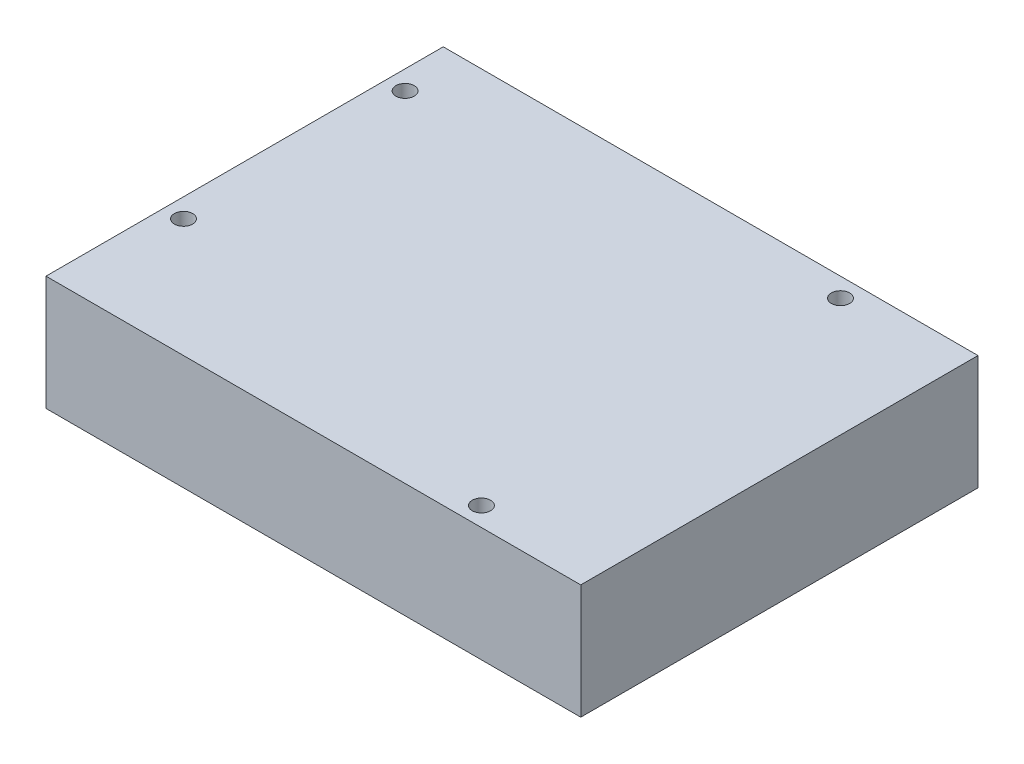
ISO-10303-21;
HEADER;
FILE_DESCRIPTION(('STEP AP214'),'2;1');
FILE_NAME('part.step','',(''),(''),'','','');
FILE_SCHEMA(('AUTOMOTIVE_DESIGN { 1 0 10303 214 1 1 1 1 }'));
ENDSEC;
DATA;
#1=APPLICATION_CONTEXT('core data for automotive mechanical design processes');
#2=APPLICATION_PROTOCOL_DEFINITION('international standard','automotive_design',2000,#1);
#3=PRODUCT_CONTEXT('',#1,'mechanical');
#4=PRODUCT('Part','Part','',(#3));
#5=PRODUCT_RELATED_PRODUCT_CATEGORY('part','',(#4));
#6=PRODUCT_DEFINITION_FORMATION('','',#4);
#7=PRODUCT_DEFINITION_CONTEXT('part definition',#1,'design');
#8=PRODUCT_DEFINITION('design','',#6,#7);
#9=PRODUCT_DEFINITION_SHAPE('','',#8);
#10=(LENGTH_UNIT() NAMED_UNIT(*) SI_UNIT(.MILLI.,.METRE.));
#11=(NAMED_UNIT(*) PLANE_ANGLE_UNIT() SI_UNIT($,.RADIAN.));
#12=(NAMED_UNIT(*) SI_UNIT($,.STERADIAN.) SOLID_ANGLE_UNIT());
#13=UNCERTAINTY_MEASURE_WITH_UNIT(LENGTH_MEASURE(1.E-05),#10,'distance_accuracy_value','');
#14=(GEOMETRIC_REPRESENTATION_CONTEXT(3) GLOBAL_UNCERTAINTY_ASSIGNED_CONTEXT((#13)) GLOBAL_UNIT_ASSIGNED_CONTEXT((#10,
#11,#12)) REPRESENTATION_CONTEXT('',''));
#15=CARTESIAN_POINT('',(0.,0.,0.));
#16=DIRECTION('',(0.,0.,1.));
#17=DIRECTION('',(1.,0.,0.));
#18=AXIS2_PLACEMENT_3D('',#15,#16,#17);
#19=CARTESIAN_POINT('',(35.,15.,-26.));
#20=DIRECTION('',(-1.,0.,0.));
#21=DIRECTION('',(0.,0.,1.));
#22=AXIS2_PLACEMENT_3D('',#19,#20,#21);
#23=PLANE('',#22);
#24=DIRECTION('',(0.,0.,-1.));
#25=VECTOR('',#24,1.);
#26=CARTESIAN_POINT('',(35.,0.,-26.));
#27=LINE('',#26,#25);
#28=CARTESIAN_POINT('',(35.,0.,26.));
#29=VERTEX_POINT('',#28);
#30=CARTESIAN_POINT('',(35.,0.,-26.));
#31=VERTEX_POINT('',#30);
#32=EDGE_CURVE('E107',#29,#31,#27,.T.);
#33=ORIENTED_EDGE('',*,*,#32,.T.);
#34=DIRECTION('',(0.,-1.,0.));
#35=VECTOR('',#34,1.);
#36=CARTESIAN_POINT('',(35.,15.,-26.));
#37=LINE('',#36,#35);
#38=CARTESIAN_POINT('',(35.,15.,-26.));
#39=VERTEX_POINT('',#38);
#40=EDGE_CURVE('E11',#39,#31,#37,.T.);
#41=ORIENTED_EDGE('',*,*,#40,.F.);
#42=DIRECTION('',(0.,0.,-1.));
#43=VECTOR('',#42,1.);
#44=CARTESIAN_POINT('',(35.,15.,-26.));
#45=LINE('',#44,#43);
#46=CARTESIAN_POINT('',(35.,15.,26.));
#47=VERTEX_POINT('',#46);
#48=EDGE_CURVE('E91',#47,#39,#45,.T.);
#49=ORIENTED_EDGE('',*,*,#48,.F.);
#50=DIRECTION('',(0.,-1.,0.));
#51=VECTOR('',#50,1.);
#52=CARTESIAN_POINT('',(35.,15.,26.));
#53=LINE('',#52,#51);
#54=EDGE_CURVE('E103',#47,#29,#53,.T.);
#55=ORIENTED_EDGE('',*,*,#54,.T.);
#56=EDGE_LOOP('',(#33,#41,#49,#55));
#57=FACE_BOUND('',#56,.T.);
#58=ADVANCED_FACE('F39',(#57),#23,.F.);
#59=CARTESIAN_POINT('',(-35.,15.,-26.));
#60=DIRECTION('',(0.,0.,1.));
#61=DIRECTION('',(1.,0.,0.));
#62=AXIS2_PLACEMENT_3D('',#59,#60,#61);
#63=PLANE('',#62);
#64=DIRECTION('',(-1.,0.,0.));
#65=VECTOR('',#64,1.);
#66=CARTESIAN_POINT('',(-35.,0.,-26.));
#67=LINE('',#66,#65);
#68=CARTESIAN_POINT('',(-35.,0.,-26.));
#69=VERTEX_POINT('',#68);
#70=EDGE_CURVE('E96',#31,#69,#67,.T.);
#71=ORIENTED_EDGE('',*,*,#70,.T.);
#72=DIRECTION('',(0.,-1.,0.));
#73=VECTOR('',#72,1.);
#74=CARTESIAN_POINT('',(-35.,15.,-26.));
#75=LINE('',#74,#73);
#76=CARTESIAN_POINT('',(-35.,15.,-26.));
#77=VERTEX_POINT('',#76);
#78=EDGE_CURVE('E48',#77,#69,#75,.T.);
#79=ORIENTED_EDGE('',*,*,#78,.F.);
#80=DIRECTION('',(-1.,0.,0.));
#81=VECTOR('',#80,1.);
#82=CARTESIAN_POINT('',(-35.,15.,-26.));
#83=LINE('',#82,#81);
#84=EDGE_CURVE('E86',#39,#77,#83,.T.);
#85=ORIENTED_EDGE('',*,*,#84,.F.);
#86=ORIENTED_EDGE('',*,*,#40,.T.);
#87=EDGE_LOOP('',(#71,#79,#85,#86));
#88=FACE_BOUND('',#87,.T.);
#89=ADVANCED_FACE('F95',(#88),#63,.F.);
#90=CARTESIAN_POINT('',(-35.,15.,-26.));
#91=DIRECTION('',(1.,0.,0.));
#92=DIRECTION('',(0.,0.,-1.));
#93=AXIS2_PLACEMENT_3D('',#90,#91,#92);
#94=PLANE('',#93);
#95=DIRECTION('',(0.,0.,1.));
#96=VECTOR('',#95,1.);
#97=CARTESIAN_POINT('',(-35.,0.,-26.));
#98=LINE('',#97,#96);
#99=CARTESIAN_POINT('',(-35.,0.,26.));
#100=VERTEX_POINT('',#99);
#101=EDGE_CURVE('E73',#69,#100,#98,.T.);
#102=ORIENTED_EDGE('',*,*,#101,.T.);
#103=DIRECTION('',(0.,-1.,0.));
#104=VECTOR('',#103,1.);
#105=CARTESIAN_POINT('',(-35.,15.,26.));
#106=LINE('',#105,#104);
#107=CARTESIAN_POINT('',(-35.,15.,26.));
#108=VERTEX_POINT('',#107);
#109=EDGE_CURVE('E98',#108,#100,#106,.T.);
#110=ORIENTED_EDGE('',*,*,#109,.F.);
#111=DIRECTION('',(0.,0.,1.));
#112=VECTOR('',#111,1.);
#113=CARTESIAN_POINT('',(-35.,15.,-26.));
#114=LINE('',#113,#112);
#115=EDGE_CURVE('E89',#77,#108,#114,.T.);
#116=ORIENTED_EDGE('',*,*,#115,.F.);
#117=ORIENTED_EDGE('',*,*,#78,.T.);
#118=EDGE_LOOP('',(#102,#110,#116,#117));
#119=FACE_BOUND('',#118,.T.);
#120=ADVANCED_FACE('F99',(#119),#94,.F.);
#121=CARTESIAN_POINT('',(-35.,15.,26.));
#122=DIRECTION('',(0.,0.,-1.));
#123=DIRECTION('',(-1.,0.,0.));
#124=AXIS2_PLACEMENT_3D('',#121,#122,#123);
#125=PLANE('',#124);
#126=DIRECTION('',(1.,0.,0.));
#127=VECTOR('',#126,1.);
#128=CARTESIAN_POINT('',(-35.,0.,26.));
#129=LINE('',#128,#127);
#130=EDGE_CURVE('E79',#100,#29,#129,.T.);
#131=ORIENTED_EDGE('',*,*,#130,.T.);
#132=ORIENTED_EDGE('',*,*,#54,.F.);
#133=DIRECTION('',(1.,0.,0.));
#134=VECTOR('',#133,1.);
#135=CARTESIAN_POINT('',(-35.,15.,26.));
#136=LINE('',#135,#134);
#137=EDGE_CURVE('E56',#108,#47,#136,.T.);
#138=ORIENTED_EDGE('',*,*,#137,.F.);
#139=ORIENTED_EDGE('',*,*,#109,.T.);
#140=EDGE_LOOP('',(#131,#132,#138,#139));
#141=FACE_BOUND('',#140,.T.);
#142=ADVANCED_FACE('F121',(#141),#125,.F.);
#143=CARTESIAN_POINT('',(0.,15.,0.));
#144=DIRECTION('',(0.,1.,0.));
#145=DIRECTION('',(0.,0.,1.));
#146=AXIS2_PLACEMENT_3D('',#143,#144,#145);
#147=PLANE('',#146);
#148=CARTESIAN_POINT('',(19.5,15.,23.5));
#149=DIRECTION('',(0.,1.,0.));
#150=DIRECTION('',(0.,0.,1.));
#151=AXIS2_PLACEMENT_3D('',#148,#149,#150);
#152=CIRCLE('',#151,1.2);
#153=CARTESIAN_POINT('',(19.5,15.,24.7));
#154=VERTEX_POINT('',#153);
#155=EDGE_CURVE('E155',#154,#154,#152,.T.);
#156=ORIENTED_EDGE('',*,*,#155,.F.);
#157=EDGE_LOOP('',(#156));
#158=FACE_BOUND('',#157,.T.);
#159=CARTESIAN_POINT('',(19.5,15.,-23.5));
#160=DIRECTION('',(0.,1.,0.));
#161=DIRECTION('',(0.,0.,1.));
#162=AXIS2_PLACEMENT_3D('',#159,#160,#161);
#163=CIRCLE('',#162,1.2);
#164=CARTESIAN_POINT('',(19.5,15.,-22.3));
#165=VERTEX_POINT('',#164);
#166=EDGE_CURVE('E147',#165,#165,#163,.T.);
#167=ORIENTED_EDGE('',*,*,#166,.F.);
#168=EDGE_LOOP('',(#167));
#169=FACE_BOUND('',#168,.T.);
#170=CARTESIAN_POINT('',(-32.5,15.,-18.5));
#171=DIRECTION('',(0.,1.,0.));
#172=DIRECTION('',(0.,0.,1.));
#173=AXIS2_PLACEMENT_3D('',#170,#171,#172);
#174=CIRCLE('',#173,1.2);
#175=CARTESIAN_POINT('',(-32.5,15.,-17.3));
#176=VERTEX_POINT('',#175);
#177=EDGE_CURVE('E139',#176,#176,#174,.T.);
#178=ORIENTED_EDGE('',*,*,#177,.F.);
#179=EDGE_LOOP('',(#178));
#180=FACE_BOUND('',#179,.T.);
#181=CARTESIAN_POINT('',(-32.5,15.,10.5));
#182=DIRECTION('',(0.,1.,0.));
#183=DIRECTION('',(0.,0.,1.));
#184=AXIS2_PLACEMENT_3D('',#181,#182,#183);
#185=CIRCLE('',#184,1.2);
#186=CARTESIAN_POINT('',(-32.5,15.,11.7));
#187=VERTEX_POINT('',#186);
#188=EDGE_CURVE('E131',#187,#187,#185,.T.);
#189=ORIENTED_EDGE('',*,*,#188,.F.);
#190=EDGE_LOOP('',(#189));
#191=FACE_BOUND('',#190,.T.);
#192=ORIENTED_EDGE('',*,*,#48,.T.);
#193=ORIENTED_EDGE('',*,*,#84,.T.);
#194=ORIENTED_EDGE('',*,*,#115,.T.);
#195=ORIENTED_EDGE('',*,*,#137,.T.);
#196=EDGE_LOOP('',(#192,#193,#194,#195));
#197=FACE_BOUND('',#196,.T.);
#198=ADVANCED_FACE('F87',(#158,#169,#180,#191,#197),#147,.T.);
#199=CARTESIAN_POINT('',(0.,0.,0.));
#200=DIRECTION('',(0.,1.,0.));
#201=DIRECTION('',(0.,0.,1.));
#202=AXIS2_PLACEMENT_3D('',#199,#200,#201);
#203=PLANE('',#202);
#204=CARTESIAN_POINT('',(19.5,0.,23.5));
#205=DIRECTION('',(0.,1.,0.));
#206=DIRECTION('',(0.,0.,1.));
#207=AXIS2_PLACEMENT_3D('',#204,#205,#206);
#208=CIRCLE('',#207,1.2);
#209=CARTESIAN_POINT('',(19.5,0.,24.7));
#210=VERTEX_POINT('',#209);
#211=EDGE_CURVE('E151',#210,#210,#208,.T.);
#212=ORIENTED_EDGE('',*,*,#211,.T.);
#213=EDGE_LOOP('',(#212));
#214=FACE_BOUND('',#213,.T.);
#215=CARTESIAN_POINT('',(19.5,0.,-23.5));
#216=DIRECTION('',(0.,1.,0.));
#217=DIRECTION('',(0.,0.,1.));
#218=AXIS2_PLACEMENT_3D('',#215,#216,#217);
#219=CIRCLE('',#218,1.2);
#220=CARTESIAN_POINT('',(19.5,0.,-22.3));
#221=VERTEX_POINT('',#220);
#222=EDGE_CURVE('E143',#221,#221,#219,.T.);
#223=ORIENTED_EDGE('',*,*,#222,.T.);
#224=EDGE_LOOP('',(#223));
#225=FACE_BOUND('',#224,.T.);
#226=CARTESIAN_POINT('',(-32.5,0.,-18.5));
#227=DIRECTION('',(0.,1.,0.));
#228=DIRECTION('',(0.,0.,1.));
#229=AXIS2_PLACEMENT_3D('',#226,#227,#228);
#230=CIRCLE('',#229,1.19999999999999);
#231=CARTESIAN_POINT('',(-32.5,0.,-17.3));
#232=VERTEX_POINT('',#231);
#233=EDGE_CURVE('E135',#232,#232,#230,.T.);
#234=ORIENTED_EDGE('',*,*,#233,.T.);
#235=EDGE_LOOP('',(#234));
#236=FACE_BOUND('',#235,.T.);
#237=CARTESIAN_POINT('',(-32.5,0.,10.5));
#238=DIRECTION('',(0.,1.,0.));
#239=DIRECTION('',(0.,0.,1.));
#240=AXIS2_PLACEMENT_3D('',#237,#238,#239);
#241=CIRCLE('',#240,1.19999999999999);
#242=CARTESIAN_POINT('',(-32.5,0.,11.7));
#243=VERTEX_POINT('',#242);
#244=EDGE_CURVE('E111',#243,#243,#241,.T.);
#245=ORIENTED_EDGE('',*,*,#244,.T.);
#246=EDGE_LOOP('',(#245));
#247=FACE_BOUND('',#246,.T.);
#248=ORIENTED_EDGE('',*,*,#32,.F.);
#249=ORIENTED_EDGE('',*,*,#130,.F.);
#250=ORIENTED_EDGE('',*,*,#101,.F.);
#251=ORIENTED_EDGE('',*,*,#70,.F.);
#252=EDGE_LOOP('',(#248,#249,#250,#251));
#253=FACE_BOUND('',#252,.T.);
#254=ADVANCED_FACE('F124',(#214,#225,#236,#247,#253),#203,.F.);
#255=CARTESIAN_POINT('',(-32.5,15.,10.5));
#256=DIRECTION('',(0.,1.,0.));
#257=DIRECTION('',(0.,0.,1.));
#258=AXIS2_PLACEMENT_3D('',#255,#256,#257);
#259=CYLINDRICAL_SURFACE('',#258,1.2);
#260=ORIENTED_EDGE('',*,*,#244,.F.);
#261=EDGE_LOOP('',(#260));
#262=FACE_BOUND('',#261,.T.);
#263=ORIENTED_EDGE('',*,*,#188,.T.);
#264=EDGE_LOOP('',(#263));
#265=FACE_BOUND('',#264,.T.);
#266=ADVANCED_FACE('F171',(#262,#265),#259,.F.);
#267=CARTESIAN_POINT('',(-32.5,15.,-18.5));
#268=DIRECTION('',(0.,1.,0.));
#269=DIRECTION('',(0.,0.,1.));
#270=AXIS2_PLACEMENT_3D('',#267,#268,#269);
#271=CYLINDRICAL_SURFACE('',#270,1.2);
#272=ORIENTED_EDGE('',*,*,#233,.F.);
#273=EDGE_LOOP('',(#272));
#274=FACE_BOUND('',#273,.T.);
#275=ORIENTED_EDGE('',*,*,#177,.T.);
#276=EDGE_LOOP('',(#275));
#277=FACE_BOUND('',#276,.T.);
#278=ADVANCED_FACE('F173',(#274,#277),#271,.F.);
#279=CARTESIAN_POINT('',(19.5,15.,-23.5));
#280=DIRECTION('',(0.,1.,0.));
#281=DIRECTION('',(0.,0.,1.));
#282=AXIS2_PLACEMENT_3D('',#279,#280,#281);
#283=CYLINDRICAL_SURFACE('',#282,1.2);
#284=ORIENTED_EDGE('',*,*,#222,.F.);
#285=EDGE_LOOP('',(#284));
#286=FACE_BOUND('',#285,.T.);
#287=ORIENTED_EDGE('',*,*,#166,.T.);
#288=EDGE_LOOP('',(#287));
#289=FACE_BOUND('',#288,.T.);
#290=ADVANCED_FACE('F180',(#286,#289),#283,.F.);
#291=CARTESIAN_POINT('',(19.5,15.,23.5));
#292=DIRECTION('',(0.,1.,0.));
#293=DIRECTION('',(0.,0.,1.));
#294=AXIS2_PLACEMENT_3D('',#291,#292,#293);
#295=CYLINDRICAL_SURFACE('',#294,1.2);
#296=ORIENTED_EDGE('',*,*,#211,.F.);
#297=EDGE_LOOP('',(#296));
#298=FACE_BOUND('',#297,.T.);
#299=ORIENTED_EDGE('',*,*,#155,.T.);
#300=EDGE_LOOP('',(#299));
#301=FACE_BOUND('',#300,.T.);
#302=ADVANCED_FACE('F160',(#298,#301),#295,.F.);
#303=CLOSED_SHELL('',(#58,#89,#120,#142,#198,#254,#266,#278,#290,#302));
#304=MANIFOLD_SOLID_BREP('B2',#303);
#305=ADVANCED_BREP_SHAPE_REPRESENTATION('',(#18,#304),#14);
#306=SHAPE_DEFINITION_REPRESENTATION(#9,#305);
ENDSEC;
END-ISO-10303-21;
